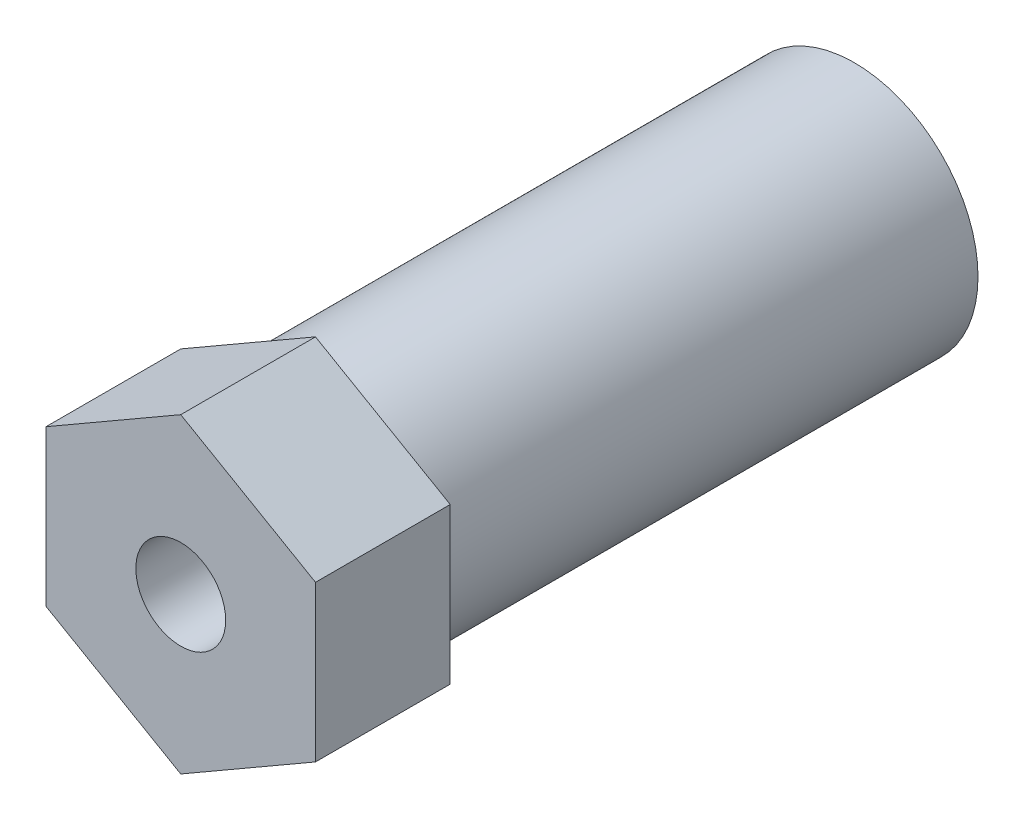
ISO-10303-21;
HEADER;
FILE_DESCRIPTION(('STEP AP214'),'2;1');
FILE_NAME('part.step','',(''),(''),'','','');
FILE_SCHEMA(('AUTOMOTIVE_DESIGN { 1 0 10303 214 1 1 1 1 }'));
ENDSEC;
DATA;
#1=APPLICATION_CONTEXT('core data for automotive mechanical design processes');
#2=APPLICATION_PROTOCOL_DEFINITION('international standard','automotive_design',2000,#1);
#3=PRODUCT_CONTEXT('',#1,'mechanical');
#4=PRODUCT('Part','Part','',(#3));
#5=PRODUCT_RELATED_PRODUCT_CATEGORY('part','',(#4));
#6=PRODUCT_DEFINITION_FORMATION('','',#4);
#7=PRODUCT_DEFINITION_CONTEXT('part definition',#1,'design');
#8=PRODUCT_DEFINITION('design','',#6,#7);
#9=PRODUCT_DEFINITION_SHAPE('','',#8);
#10=(LENGTH_UNIT() NAMED_UNIT(*) SI_UNIT(.MILLI.,.METRE.));
#11=(NAMED_UNIT(*) PLANE_ANGLE_UNIT() SI_UNIT($,.RADIAN.));
#12=(NAMED_UNIT(*) SI_UNIT($,.STERADIAN.) SOLID_ANGLE_UNIT());
#13=UNCERTAINTY_MEASURE_WITH_UNIT(LENGTH_MEASURE(1.E-05),#10,'distance_accuracy_value','');
#14=(GEOMETRIC_REPRESENTATION_CONTEXT(3) GLOBAL_UNCERTAINTY_ASSIGNED_CONTEXT((#13)) GLOBAL_UNIT_ASSIGNED_CONTEXT((#10,
#11,#12)) REPRESENTATION_CONTEXT('',''));
#15=CARTESIAN_POINT('',(0.,0.,0.));
#16=DIRECTION('',(0.,0.,1.));
#17=DIRECTION('',(1.,0.,0.));
#18=AXIS2_PLACEMENT_3D('',#15,#16,#17);
#19=CARTESIAN_POINT('',(0.,0.,-24.));
#20=DIRECTION('',(0.,0.,1.));
#21=DIRECTION('',(1.,0.,0.));
#22=AXIS2_PLACEMENT_3D('',#19,#20,#21);
#23=CYLINDRICAL_SURFACE('',#22,5.5);
#24=CARTESIAN_POINT('',(0.,0.,-24.));
#25=DIRECTION('',(0.,0.,1.));
#26=DIRECTION('',(1.,0.,0.));
#27=AXIS2_PLACEMENT_3D('',#24,#25,#26);
#28=CIRCLE('',#27,5.5);
#29=CARTESIAN_POINT('',(5.5,0.,-24.));
#30=VERTEX_POINT('',#29);
#31=EDGE_CURVE('E11',#30,#30,#28,.T.);
#32=ORIENTED_EDGE('',*,*,#31,.T.);
#33=EDGE_LOOP('',(#32));
#34=FACE_BOUND('',#33,.T.);
#35=CARTESIAN_POINT('',(0.,0.,0.));
#36=DIRECTION('',(0.,0.,1.));
#37=DIRECTION('',(1.,0.,0.));
#38=AXIS2_PLACEMENT_3D('',#35,#36,#37);
#39=CIRCLE('',#38,5.5);
#40=CARTESIAN_POINT('',(5.5,0.,0.));
#41=VERTEX_POINT('',#40);
#42=EDGE_CURVE('E50',#41,#41,#39,.T.);
#43=ORIENTED_EDGE('',*,*,#42,.F.);
#44=EDGE_LOOP('',(#43));
#45=FACE_BOUND('',#44,.T.);
#46=ADVANCED_FACE('F43',(#34,#45),#23,.T.);
#47=CARTESIAN_POINT('',(0.,0.,-24.));
#48=DIRECTION('',(0.,0.,1.));
#49=DIRECTION('',(1.,0.,0.));
#50=AXIS2_PLACEMENT_3D('',#47,#48,#49);
#51=PLANE('',#50);
#52=CARTESIAN_POINT('',(0.,0.,-24.));
#53=DIRECTION('',(0.,0.,-1.));
#54=DIRECTION('',(-1.,0.,0.));
#55=AXIS2_PLACEMENT_3D('',#52,#53,#54);
#56=CIRCLE('',#55,3.);
#57=CARTESIAN_POINT('',(-3.,0.,-24.));
#58=VERTEX_POINT('',#57);
#59=EDGE_CURVE('E56',#58,#58,#56,.T.);
#60=ORIENTED_EDGE('',*,*,#59,.F.);
#61=EDGE_LOOP('',(#60));
#62=FACE_BOUND('',#61,.T.);
#63=ORIENTED_EDGE('',*,*,#31,.F.);
#64=EDGE_LOOP('',(#63));
#65=FACE_BOUND('',#64,.T.);
#66=ADVANCED_FACE('F68',(#62,#65),#51,.F.);
#67=CARTESIAN_POINT('',(0.,0.,0.));
#68=DIRECTION('',(0.,0.,1.));
#69=DIRECTION('',(1.,0.,0.));
#70=AXIS2_PLACEMENT_3D('',#67,#68,#69);
#71=PLANE('',#70);
#72=CARTESIAN_POINT('',(0.,0.,0.));
#73=DIRECTION('',(0.,0.,1.));
#74=DIRECTION('',(1.,0.,0.));
#75=AXIS2_PLACEMENT_3D('',#72,#73,#74);
#76=CIRCLE('',#75,3.);
#77=CARTESIAN_POINT('',(3.,0.,0.));
#78=VERTEX_POINT('',#77);
#79=EDGE_CURVE('E46',#78,#78,#76,.T.);
#80=ORIENTED_EDGE('',*,*,#79,.F.);
#81=EDGE_LOOP('',(#80));
#82=FACE_BOUND('',#81,.T.);
#83=ORIENTED_EDGE('',*,*,#42,.T.);
#84=EDGE_LOOP('',(#83));
#85=FACE_BOUND('',#84,.T.);
#86=ADVANCED_FACE('F65',(#82,#85),#71,.T.);
#87=CARTESIAN_POINT('',(0.,0.,1.));
#88=DIRECTION('',(0.,0.,-1.));
#89=DIRECTION('',(-1.,0.,0.));
#90=AXIS2_PLACEMENT_3D('',#87,#88,#89);
#91=CYLINDRICAL_SURFACE('',#90,3.);
#92=ORIENTED_EDGE('',*,*,#79,.T.);
#93=EDGE_LOOP('',(#92));
#94=FACE_BOUND('',#93,.T.);
#95=ORIENTED_EDGE('',*,*,#59,.T.);
#96=EDGE_LOOP('',(#95));
#97=FACE_BOUND('',#96,.T.);
#98=ADVANCED_FACE('F63',(#94,#97),#91,.F.);
#99=CLOSED_SHELL('',(#46,#66,#86,#98));
#100=MANIFOLD_SOLID_BREP('B2',#99);
#101=CARTESIAN_POINT('',(3.,-5.19615242270663,6.));
#102=DIRECTION('',(-0.5,0.866025403784438,0.));
#103=DIRECTION('',(-0.866025403784439,-0.5,0.));
#104=AXIS2_PLACEMENT_3D('',#101,#102,#103);
#105=PLANE('',#104);
#106=DIRECTION('',(0.866025403784438,0.5,0.));
#107=VECTOR('',#106,1.);
#108=CARTESIAN_POINT('',(3.,-5.19615242270663,0.));
#109=LINE('',#108,#107);
#110=CARTESIAN_POINT('',(0.,-6.92820323027551,0.));
#111=VERTEX_POINT('',#110);
#112=CARTESIAN_POINT('',(6.,-3.46410161513775,0.));
#113=VERTEX_POINT('',#112);
#114=EDGE_CURVE('E193',#111,#113,#109,.T.);
#115=ORIENTED_EDGE('',*,*,#114,.T.);
#116=DIRECTION('',(0.,0.,-1.));
#117=VECTOR('',#116,1.);
#118=CARTESIAN_POINT('',(6.,-3.46410161513775,6.));
#119=LINE('',#118,#117);
#120=CARTESIAN_POINT('',(6.,-3.46410161513775,6.));
#121=VERTEX_POINT('',#120);
#122=EDGE_CURVE('E41',#121,#113,#119,.T.);
#123=ORIENTED_EDGE('',*,*,#122,.F.);
#124=DIRECTION('',(0.866025403784438,0.5,0.));
#125=VECTOR('',#124,1.);
#126=CARTESIAN_POINT('',(3.,-5.19615242270663,6.));
#127=LINE('',#126,#125);
#128=CARTESIAN_POINT('',(0.,-6.92820323027551,6.));
#129=VERTEX_POINT('',#128);
#130=EDGE_CURVE('E216',#129,#121,#127,.T.);
#131=ORIENTED_EDGE('',*,*,#130,.F.);
#132=DIRECTION('',(0.,0.,-1.));
#133=VECTOR('',#132,1.);
#134=CARTESIAN_POINT('',(0.,-6.92820323027551,6.));
#135=LINE('',#134,#133);
#136=EDGE_CURVE('E186',#129,#111,#135,.T.);
#137=ORIENTED_EDGE('',*,*,#136,.T.);
#138=EDGE_LOOP('',(#115,#123,#131,#137));
#139=FACE_BOUND('',#138,.T.);
#140=ADVANCED_FACE('F105',(#139),#105,.F.);
#141=CARTESIAN_POINT('',(6.,0.,6.));
#142=DIRECTION('',(-1.,0.,0.));
#143=DIRECTION('',(0.,0.,1.));
#144=AXIS2_PLACEMENT_3D('',#141,#142,#143);
#145=PLANE('',#144);
#146=DIRECTION('',(0.,1.,0.));
#147=VECTOR('',#146,1.);
#148=CARTESIAN_POINT('',(6.,0.,0.));
#149=LINE('',#148,#147);
#150=CARTESIAN_POINT('',(6.,3.46410161513776,0.));
#151=VERTEX_POINT('',#150);
#152=EDGE_CURVE('E196',#113,#151,#149,.T.);
#153=ORIENTED_EDGE('',*,*,#152,.T.);
#154=DIRECTION('',(0.,0.,-1.));
#155=VECTOR('',#154,1.);
#156=CARTESIAN_POINT('',(6.,3.46410161513776,6.));
#157=LINE('',#156,#155);
#158=CARTESIAN_POINT('',(6.,3.46410161513776,6.));
#159=VERTEX_POINT('',#158);
#160=EDGE_CURVE('E114',#159,#151,#157,.T.);
#161=ORIENTED_EDGE('',*,*,#160,.F.);
#162=DIRECTION('',(0.,1.,0.));
#163=VECTOR('',#162,1.);
#164=CARTESIAN_POINT('',(6.,0.,6.));
#165=LINE('',#164,#163);
#166=EDGE_CURVE('E159',#121,#159,#165,.T.);
#167=ORIENTED_EDGE('',*,*,#166,.F.);
#168=ORIENTED_EDGE('',*,*,#122,.T.);
#169=EDGE_LOOP('',(#153,#161,#167,#168));
#170=FACE_BOUND('',#169,.T.);
#171=ADVANCED_FACE('F230',(#170),#145,.F.);
#172=CARTESIAN_POINT('',(3.,5.19615242270663,6.));
#173=DIRECTION('',(-0.5,-0.866025403784438,0.));
#174=DIRECTION('',(0.866025403784439,-0.5,0.));
#175=AXIS2_PLACEMENT_3D('',#172,#173,#174);
#176=PLANE('',#175);
#177=DIRECTION('',(-0.866025403784439,0.5,0.));
#178=VECTOR('',#177,1.);
#179=CARTESIAN_POINT('',(3.,5.19615242270663,0.));
#180=LINE('',#179,#178);
#181=CARTESIAN_POINT('',(0.,6.92820323027551,0.));
#182=VERTEX_POINT('',#181);
#183=EDGE_CURVE('E198',#151,#182,#180,.T.);
#184=ORIENTED_EDGE('',*,*,#183,.T.);
#185=DIRECTION('',(0.,0.,-1.));
#186=VECTOR('',#185,1.);
#187=CARTESIAN_POINT('',(0.,6.92820323027551,6.));
#188=LINE('',#187,#186);
#189=CARTESIAN_POINT('',(0.,6.92820323027551,6.));
#190=VERTEX_POINT('',#189);
#191=EDGE_CURVE('E181',#190,#182,#188,.T.);
#192=ORIENTED_EDGE('',*,*,#191,.F.);
#193=DIRECTION('',(-0.866025403784439,0.5,0.));
#194=VECTOR('',#193,1.);
#195=CARTESIAN_POINT('',(3.,5.19615242270663,6.));
#196=LINE('',#195,#194);
#197=EDGE_CURVE('E172',#159,#190,#196,.T.);
#198=ORIENTED_EDGE('',*,*,#197,.F.);
#199=ORIENTED_EDGE('',*,*,#160,.T.);
#200=EDGE_LOOP('',(#184,#192,#198,#199));
#201=FACE_BOUND('',#200,.T.);
#202=ADVANCED_FACE('F209',(#201),#176,.F.);
#203=CARTESIAN_POINT('',(-3.,5.19615242270663,6.));
#204=DIRECTION('',(0.5,-0.866025403784439,0.));
#205=DIRECTION('',(0.866025403784439,0.5,0.));
#206=AXIS2_PLACEMENT_3D('',#203,#204,#205);
#207=PLANE('',#206);
#208=DIRECTION('',(-0.866025403784439,-0.5,0.));
#209=VECTOR('',#208,1.);
#210=CARTESIAN_POINT('',(-3.,5.19615242270663,0.));
#211=LINE('',#210,#209);
#212=CARTESIAN_POINT('',(-6.,3.46410161513776,0.));
#213=VERTEX_POINT('',#212);
#214=EDGE_CURVE('E180',#182,#213,#211,.T.);
#215=ORIENTED_EDGE('',*,*,#214,.T.);
#216=DIRECTION('',(0.,0.,-1.));
#217=VECTOR('',#216,1.);
#218=CARTESIAN_POINT('',(-6.,3.46410161513776,6.));
#219=LINE('',#218,#217);
#220=CARTESIAN_POINT('',(-6.,3.46410161513776,6.));
#221=VERTEX_POINT('',#220);
#222=EDGE_CURVE('E177',#221,#213,#219,.T.);
#223=ORIENTED_EDGE('',*,*,#222,.F.);
#224=DIRECTION('',(-0.866025403784439,-0.5,0.));
#225=VECTOR('',#224,1.);
#226=CARTESIAN_POINT('',(-3.,5.19615242270663,6.));
#227=LINE('',#226,#225);
#228=EDGE_CURVE('E166',#190,#221,#227,.T.);
#229=ORIENTED_EDGE('',*,*,#228,.F.);
#230=ORIENTED_EDGE('',*,*,#191,.T.);
#231=EDGE_LOOP('',(#215,#223,#229,#230));
#232=FACE_BOUND('',#231,.T.);
#233=ADVANCED_FACE('F178',(#232),#207,.F.);
#234=CARTESIAN_POINT('',(-6.,0.,6.));
#235=DIRECTION('',(1.,0.,0.));
#236=DIRECTION('',(0.,1.,0.));
#237=AXIS2_PLACEMENT_3D('',#234,#235,#236);
#238=PLANE('',#237);
#239=DIRECTION('',(0.,-1.,0.));
#240=VECTOR('',#239,1.);
#241=CARTESIAN_POINT('',(-6.,0.,0.));
#242=LINE('',#241,#240);
#243=CARTESIAN_POINT('',(-6.00000000000001,-3.46410161513776,0.));
#244=VERTEX_POINT('',#243);
#245=EDGE_CURVE('E145',#213,#244,#242,.T.);
#246=ORIENTED_EDGE('',*,*,#245,.T.);
#247=DIRECTION('',(0.,0.,-1.));
#248=VECTOR('',#247,1.);
#249=CARTESIAN_POINT('',(-6.00000000000001,-3.46410161513776,6.));
#250=LINE('',#249,#248);
#251=CARTESIAN_POINT('',(-6.00000000000001,-3.46410161513776,6.));
#252=VERTEX_POINT('',#251);
#253=EDGE_CURVE('E182',#252,#244,#250,.T.);
#254=ORIENTED_EDGE('',*,*,#253,.F.);
#255=DIRECTION('',(0.,-1.,0.));
#256=VECTOR('',#255,1.);
#257=CARTESIAN_POINT('',(-6.,0.,6.));
#258=LINE('',#257,#256);
#259=EDGE_CURVE('E170',#221,#252,#258,.T.);
#260=ORIENTED_EDGE('',*,*,#259,.F.);
#261=ORIENTED_EDGE('',*,*,#222,.T.);
#262=EDGE_LOOP('',(#246,#254,#260,#261));
#263=FACE_BOUND('',#262,.T.);
#264=ADVANCED_FACE('F184',(#263),#238,.F.);
#265=CARTESIAN_POINT('',(0.,0.,6.));
#266=DIRECTION('',(0.,0.,-1.));
#267=DIRECTION('',(-1.,0.,0.));
#268=AXIS2_PLACEMENT_3D('',#265,#266,#267);
#269=CYLINDRICAL_SURFACE('',#268,2.);
#270=CARTESIAN_POINT('',(0.,0.,6.));
#271=DIRECTION('',(0.,0.,1.));
#272=DIRECTION('',(1.,0.,0.));
#273=AXIS2_PLACEMENT_3D('',#270,#271,#272);
#274=CIRCLE('',#273,2.);
#275=CARTESIAN_POINT('',(2.,0.,6.));
#276=VERTEX_POINT('',#275);
#277=EDGE_CURVE('E203',#276,#276,#274,.T.);
#278=ORIENTED_EDGE('',*,*,#277,.T.);
#279=EDGE_LOOP('',(#278));
#280=FACE_BOUND('',#279,.T.);
#281=CARTESIAN_POINT('',(0.,0.,0.));
#282=DIRECTION('',(0.,0.,1.));
#283=DIRECTION('',(1.,0.,0.));
#284=AXIS2_PLACEMENT_3D('',#281,#282,#283);
#285=CIRCLE('',#284,2.);
#286=CARTESIAN_POINT('',(2.,0.,0.));
#287=VERTEX_POINT('',#286);
#288=EDGE_CURVE('E190',#287,#287,#285,.T.);
#289=ORIENTED_EDGE('',*,*,#288,.F.);
#290=EDGE_LOOP('',(#289));
#291=FACE_BOUND('',#290,.T.);
#292=ADVANCED_FACE('F107',(#280,#291),#269,.F.);
#293=CARTESIAN_POINT('',(-3.,-5.19615242270664,6.));
#294=DIRECTION('',(0.5,0.866025403784439,0.));
#295=DIRECTION('',(-0.866025403784439,0.5,0.));
#296=AXIS2_PLACEMENT_3D('',#293,#294,#295);
#297=PLANE('',#296);
#298=DIRECTION('',(0.866025403784439,-0.5,0.));
#299=VECTOR('',#298,1.);
#300=CARTESIAN_POINT('',(-3.,-5.19615242270664,0.));
#301=LINE('',#300,#299);
#302=EDGE_CURVE('E151',#244,#111,#301,.T.);
#303=ORIENTED_EDGE('',*,*,#302,.T.);
#304=ORIENTED_EDGE('',*,*,#136,.F.);
#305=DIRECTION('',(0.866025403784439,-0.5,0.));
#306=VECTOR('',#305,1.);
#307=CARTESIAN_POINT('',(-3.,-5.19615242270664,6.));
#308=LINE('',#307,#306);
#309=EDGE_CURVE('E122',#252,#129,#308,.T.);
#310=ORIENTED_EDGE('',*,*,#309,.F.);
#311=ORIENTED_EDGE('',*,*,#253,.T.);
#312=EDGE_LOOP('',(#303,#304,#310,#311));
#313=FACE_BOUND('',#312,.T.);
#314=ADVANCED_FACE('F217',(#313),#297,.F.);
#315=CARTESIAN_POINT('',(0.,0.,6.));
#316=DIRECTION('',(0.,0.,1.));
#317=DIRECTION('',(1.,0.,0.));
#318=AXIS2_PLACEMENT_3D('',#315,#316,#317);
#319=PLANE('',#318);
#320=ORIENTED_EDGE('',*,*,#277,.F.);
#321=EDGE_LOOP('',(#320));
#322=FACE_BOUND('',#321,.T.);
#323=ORIENTED_EDGE('',*,*,#130,.T.);
#324=ORIENTED_EDGE('',*,*,#166,.T.);
#325=ORIENTED_EDGE('',*,*,#197,.T.);
#326=ORIENTED_EDGE('',*,*,#228,.T.);
#327=ORIENTED_EDGE('',*,*,#259,.T.);
#328=ORIENTED_EDGE('',*,*,#309,.T.);
#329=EDGE_LOOP('',(#323,#324,#325,#326,#327,#328));
#330=FACE_BOUND('',#329,.T.);
#331=ADVANCED_FACE('F168',(#322,#330),#319,.T.);
#332=CARTESIAN_POINT('',(0.,0.,0.));
#333=DIRECTION('',(0.,0.,1.));
#334=DIRECTION('',(1.,0.,0.));
#335=AXIS2_PLACEMENT_3D('',#332,#333,#334);
#336=PLANE('',#335);
#337=ORIENTED_EDGE('',*,*,#288,.T.);
#338=EDGE_LOOP('',(#337));
#339=FACE_BOUND('',#338,.T.);
#340=ORIENTED_EDGE('',*,*,#114,.F.);
#341=ORIENTED_EDGE('',*,*,#302,.F.);
#342=ORIENTED_EDGE('',*,*,#245,.F.);
#343=ORIENTED_EDGE('',*,*,#214,.F.);
#344=ORIENTED_EDGE('',*,*,#183,.F.);
#345=ORIENTED_EDGE('',*,*,#152,.F.);
#346=EDGE_LOOP('',(#340,#341,#342,#343,#344,#345));
#347=FACE_BOUND('',#346,.T.);
#348=ADVANCED_FACE('F212',(#339,#347),#336,.F.);
#349=CLOSED_SHELL('',(#140,#171,#202,#233,#264,#292,#314,#331,#348));
#350=MANIFOLD_SOLID_BREP('B6',#349);
#351=ADVANCED_BREP_SHAPE_REPRESENTATION('',(#18,#100,#350),#14);
#352=SHAPE_DEFINITION_REPRESENTATION(#9,#351);
ENDSEC;
END-ISO-10303-21;
